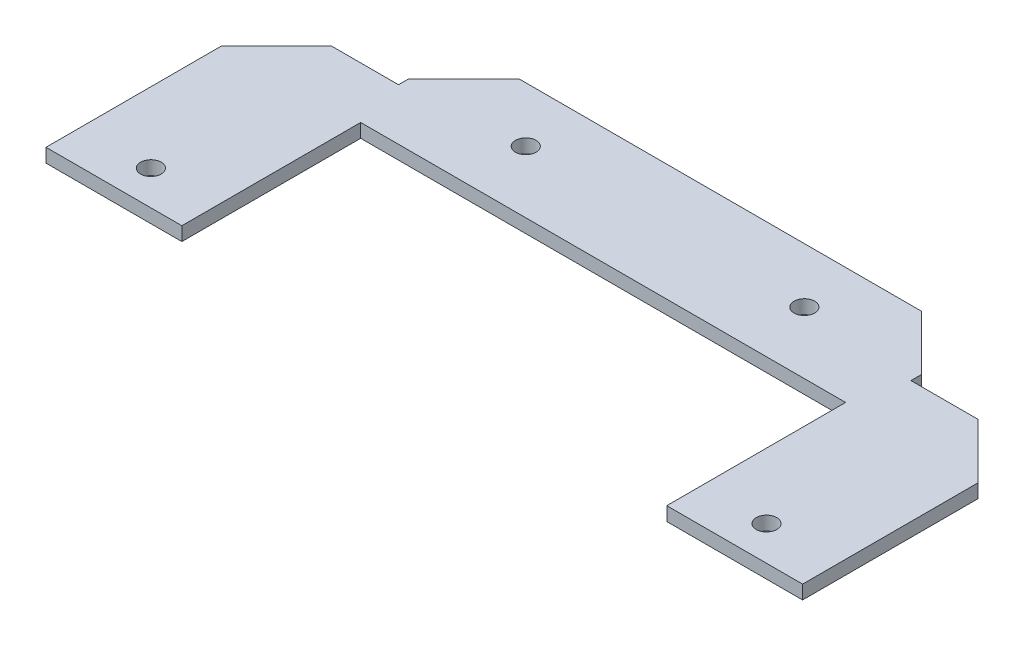
ISO-10303-21;
HEADER;
FILE_DESCRIPTION(('STEP AP214'),'2;1');
FILE_NAME('part.step','',(''),(''),'','','');
FILE_SCHEMA(('AUTOMOTIVE_DESIGN { 1 0 10303 214 1 1 1 1 }'));
ENDSEC;
DATA;
#1=APPLICATION_CONTEXT('core data for automotive mechanical design processes');
#2=APPLICATION_PROTOCOL_DEFINITION('international standard','automotive_design',2000,#1);
#3=PRODUCT_CONTEXT('',#1,'mechanical');
#4=PRODUCT('Part','Part','',(#3));
#5=PRODUCT_RELATED_PRODUCT_CATEGORY('part','',(#4));
#6=PRODUCT_DEFINITION_FORMATION('','',#4);
#7=PRODUCT_DEFINITION_CONTEXT('part definition',#1,'design');
#8=PRODUCT_DEFINITION('design','',#6,#7);
#9=PRODUCT_DEFINITION_SHAPE('','',#8);
#10=(LENGTH_UNIT() NAMED_UNIT(*) SI_UNIT(.MILLI.,.METRE.));
#11=(NAMED_UNIT(*) PLANE_ANGLE_UNIT() SI_UNIT($,.RADIAN.));
#12=(NAMED_UNIT(*) SI_UNIT($,.STERADIAN.) SOLID_ANGLE_UNIT());
#13=UNCERTAINTY_MEASURE_WITH_UNIT(LENGTH_MEASURE(1.E-05),#10,'distance_accuracy_value','');
#14=(GEOMETRIC_REPRESENTATION_CONTEXT(3) GLOBAL_UNCERTAINTY_ASSIGNED_CONTEXT((#13)) GLOBAL_UNIT_ASSIGNED_CONTEXT((#10,
#11,#12)) REPRESENTATION_CONTEXT('',''));
#15=CARTESIAN_POINT('',(0.,0.,0.));
#16=DIRECTION('',(0.,0.,1.));
#17=DIRECTION('',(1.,0.,0.));
#18=AXIS2_PLACEMENT_3D('',#15,#16,#17);
#19=CARTESIAN_POINT('',(0.,2.,0.));
#20=DIRECTION('',(0.,1.,0.));
#21=DIRECTION('',(0.,0.,1.));
#22=AXIS2_PLACEMENT_3D('',#19,#20,#21);
#23=PLANE('',#22);
#24=CARTESIAN_POINT('',(75.25,2.,-35.));
#25=DIRECTION('',(0.,1.,0.));
#26=DIRECTION('',(0.,0.,-1.));
#27=AXIS2_PLACEMENT_3D('',#24,#25,#26);
#28=CIRCLE('',#27,1.50000000000001);
#29=CARTESIAN_POINT('',(75.25,2.,-36.5));
#30=VERTEX_POINT('',#29);
#31=EDGE_CURVE('E346',#30,#30,#28,.T.);
#32=ORIENTED_EDGE('',*,*,#31,.F.);
#33=EDGE_LOOP('',(#32));
#34=FACE_BOUND('',#33,.T.);
#35=CARTESIAN_POINT('',(10.25,2.,-5.));
#36=DIRECTION('',(0.,1.,0.));
#37=DIRECTION('',(0.,0.,1.));
#38=AXIS2_PLACEMENT_3D('',#35,#36,#37);
#39=CIRCLE('',#38,1.5);
#40=CARTESIAN_POINT('',(10.25,2.,-3.5));
#41=VERTEX_POINT('',#40);
#42=EDGE_CURVE('E185',#41,#41,#39,.T.);
#43=ORIENTED_EDGE('',*,*,#42,.F.);
#44=EDGE_LOOP('',(#43));
#45=FACE_BOUND('',#44,.T.);
#46=DIRECTION('',(0.,0.,1.));
#47=VECTOR('',#46,1.);
#48=CARTESIAN_POINT('',(0.,2.,-25.5));
#49=LINE('',#48,#47);
#50=CARTESIAN_POINT('',(0.,2.,-25.5));
#51=VERTEX_POINT('',#50);
#52=CARTESIAN_POINT('',(0.,2.,0.));
#53=VERTEX_POINT('',#52);
#54=EDGE_CURVE('E212',#51,#53,#49,.T.);
#55=ORIENTED_EDGE('',*,*,#54,.T.);
#56=DIRECTION('',(1.,0.,0.));
#57=VECTOR('',#56,1.);
#58=CARTESIAN_POINT('',(0.,2.,0.));
#59=LINE('',#58,#57);
#60=CARTESIAN_POINT('',(19.75,2.,0.));
#61=VERTEX_POINT('',#60);
#62=EDGE_CURVE('E120',#53,#61,#59,.T.);
#63=ORIENTED_EDGE('',*,*,#62,.T.);
#64=DIRECTION('',(0.,0.,-1.));
#65=VECTOR('',#64,1.);
#66=CARTESIAN_POINT('',(19.75,2.,0.));
#67=LINE('',#66,#65);
#68=CARTESIAN_POINT('',(19.75,2.,-26.));
#69=VERTEX_POINT('',#68);
#70=EDGE_CURVE('E251',#61,#69,#67,.T.);
#71=ORIENTED_EDGE('',*,*,#70,.T.);
#72=DIRECTION('',(1.,0.,0.));
#73=VECTOR('',#72,1.);
#74=CARTESIAN_POINT('',(19.75,2.,-26.));
#75=LINE('',#74,#73);
#76=CARTESIAN_POINT('',(90.25,2.,-26.));
#77=VERTEX_POINT('',#76);
#78=EDGE_CURVE('E270',#69,#77,#75,.T.);
#79=ORIENTED_EDGE('',*,*,#78,.T.);
#80=DIRECTION('',(0.,0.,1.));
#81=VECTOR('',#80,1.);
#82=CARTESIAN_POINT('',(90.25,2.,0.));
#83=LINE('',#82,#81);
#84=CARTESIAN_POINT('',(90.25,2.,0.));
#85=VERTEX_POINT('',#84);
#86=EDGE_CURVE('E267',#77,#85,#83,.T.);
#87=ORIENTED_EDGE('',*,*,#86,.T.);
#88=DIRECTION('',(1.,0.,0.));
#89=VECTOR('',#88,1.);
#90=CARTESIAN_POINT('',(110.,2.,0.));
#91=LINE('',#90,#89);
#92=CARTESIAN_POINT('',(110.,2.,0.));
#93=VERTEX_POINT('',#92);
#94=EDGE_CURVE('E269',#85,#93,#91,.T.);
#95=ORIENTED_EDGE('',*,*,#94,.T.);
#96=DIRECTION('',(0.,0.,-1.));
#97=VECTOR('',#96,1.);
#98=CARTESIAN_POINT('',(110.,2.,-25.5));
#99=LINE('',#98,#97);
#100=CARTESIAN_POINT('',(110.,2.,-25.5));
#101=VERTEX_POINT('',#100);
#102=EDGE_CURVE('E272',#93,#101,#99,.T.);
#103=ORIENTED_EDGE('',*,*,#102,.T.);
#104=DIRECTION('',(-0.707106781186547,0.,-0.707106781186548));
#105=VECTOR('',#104,1.);
#106=CARTESIAN_POINT('',(110.,2.,-25.5));
#107=LINE('',#106,#105);
#108=CARTESIAN_POINT('',(102.,2.,-33.5));
#109=VERTEX_POINT('',#108);
#110=EDGE_CURVE('E278',#101,#109,#107,.T.);
#111=ORIENTED_EDGE('',*,*,#110,.T.);
#112=DIRECTION('',(-1.,0.,0.));
#113=VECTOR('',#112,1.);
#114=CARTESIAN_POINT('',(92.25,2.,-33.5));
#115=LINE('',#114,#113);
#116=CARTESIAN_POINT('',(92.25,2.,-33.5));
#117=VERTEX_POINT('',#116);
#118=EDGE_CURVE('E280',#109,#117,#115,.T.);
#119=ORIENTED_EDGE('',*,*,#118,.T.);
#120=DIRECTION('',(0.,0.,-1.));
#121=VECTOR('',#120,1.);
#122=CARTESIAN_POINT('',(92.25,2.,-35.));
#123=LINE('',#122,#121);
#124=CARTESIAN_POINT('',(92.25,2.,-35.));
#125=VERTEX_POINT('',#124);
#126=EDGE_CURVE('E282',#117,#125,#123,.T.);
#127=ORIENTED_EDGE('',*,*,#126,.T.);
#128=DIRECTION('',(-0.707106781186547,0.,-0.707106781186548));
#129=VECTOR('',#128,1.);
#130=CARTESIAN_POINT('',(92.25,2.,-35.));
#131=LINE('',#130,#129);
#132=CARTESIAN_POINT('',(84.25,2.,-43.));
#133=VERTEX_POINT('',#132);
#134=EDGE_CURVE('E284',#125,#133,#131,.T.);
#135=ORIENTED_EDGE('',*,*,#134,.T.);
#136=DIRECTION('',(-1.,0.,0.));
#137=VECTOR('',#136,1.);
#138=CARTESIAN_POINT('',(84.25,2.,-43.));
#139=LINE('',#138,#137);
#140=CARTESIAN_POINT('',(25.75,2.,-43.));
#141=VERTEX_POINT('',#140);
#142=EDGE_CURVE('E286',#133,#141,#139,.T.);
#143=ORIENTED_EDGE('',*,*,#142,.T.);
#144=DIRECTION('',(-0.707106781186547,0.,0.707106781186548));
#145=VECTOR('',#144,1.);
#146=CARTESIAN_POINT('',(17.75,2.,-35.));
#147=LINE('',#146,#145);
#148=CARTESIAN_POINT('',(17.75,2.,-35.));
#149=VERTEX_POINT('',#148);
#150=EDGE_CURVE('E163',#141,#149,#147,.T.);
#151=ORIENTED_EDGE('',*,*,#150,.T.);
#152=DIRECTION('',(0.,0.,1.));
#153=VECTOR('',#152,1.);
#154=CARTESIAN_POINT('',(17.75,2.,-35.));
#155=LINE('',#154,#153);
#156=CARTESIAN_POINT('',(17.75,2.,-33.5));
#157=VERTEX_POINT('',#156);
#158=EDGE_CURVE('E157',#149,#157,#155,.T.);
#159=ORIENTED_EDGE('',*,*,#158,.T.);
#160=DIRECTION('',(-1.,0.,0.));
#161=VECTOR('',#160,1.);
#162=CARTESIAN_POINT('',(17.75,2.,-33.5));
#163=LINE('',#162,#161);
#164=CARTESIAN_POINT('',(7.99999999999997,2.,-33.5));
#165=VERTEX_POINT('',#164);
#166=EDGE_CURVE('E161',#157,#165,#163,.T.);
#167=ORIENTED_EDGE('',*,*,#166,.T.);
#168=DIRECTION('',(-0.707106781186546,0.,0.707106781186549));
#169=VECTOR('',#168,1.);
#170=CARTESIAN_POINT('',(0.,2.,-25.5));
#171=LINE('',#170,#169);
#172=EDGE_CURVE('E53',#165,#51,#171,.T.);
#173=ORIENTED_EDGE('',*,*,#172,.T.);
#174=EDGE_LOOP('',(#55,#63,#71,#79,#87,#95,#103,#111,#119,#127,#135,#143,#151,#159,#167,#173));
#175=FACE_BOUND('',#174,.T.);
#176=CARTESIAN_POINT('',(34.75,2.,-35.));
#177=DIRECTION('',(0.,1.,0.));
#178=DIRECTION('',(0.,0.,1.));
#179=AXIS2_PLACEMENT_3D('',#176,#177,#178);
#180=CIRCLE('',#179,1.5);
#181=CARTESIAN_POINT('',(34.75,2.,-33.5));
#182=VERTEX_POINT('',#181);
#183=EDGE_CURVE('E352',#182,#182,#180,.T.);
#184=ORIENTED_EDGE('',*,*,#183,.F.);
#185=EDGE_LOOP('',(#184));
#186=FACE_BOUND('',#185,.T.);
#187=CARTESIAN_POINT('',(99.75,2.,-5.00000000000001));
#188=DIRECTION('',(0.,1.,0.));
#189=DIRECTION('',(0.,0.,-1.));
#190=AXIS2_PLACEMENT_3D('',#187,#188,#189);
#191=CIRCLE('',#190,1.5);
#192=CARTESIAN_POINT('',(99.75,2.,-6.50000000000001));
#193=VERTEX_POINT('',#192);
#194=EDGE_CURVE('E337',#193,#193,#191,.T.);
#195=ORIENTED_EDGE('',*,*,#194,.F.);
#196=EDGE_LOOP('',(#195));
#197=FACE_BOUND('',#196,.T.);
#198=ADVANCED_FACE('F36',(#34,#45,#175,#186,#197),#23,.T.);
#199=CARTESIAN_POINT('',(0.,0.,0.));
#200=DIRECTION('',(0.,1.,0.));
#201=DIRECTION('',(0.,0.,1.));
#202=AXIS2_PLACEMENT_3D('',#199,#200,#201);
#203=PLANE('',#202);
#204=DIRECTION('',(0.,0.,1.));
#205=VECTOR('',#204,1.);
#206=CARTESIAN_POINT('',(0.,0.,-25.5));
#207=LINE('',#206,#205);
#208=CARTESIAN_POINT('',(0.,0.,-25.5));
#209=VERTEX_POINT('',#208);
#210=CARTESIAN_POINT('',(0.,0.,0.));
#211=VERTEX_POINT('',#210);
#212=EDGE_CURVE('E181',#209,#211,#207,.T.);
#213=ORIENTED_EDGE('',*,*,#212,.F.);
#214=DIRECTION('',(-0.707106781186546,0.,0.707106781186549));
#215=VECTOR('',#214,1.);
#216=CARTESIAN_POINT('',(0.,0.,-25.5));
#217=LINE('',#216,#215);
#218=CARTESIAN_POINT('',(7.99999999999997,0.,-33.5));
#219=VERTEX_POINT('',#218);
#220=EDGE_CURVE('E112',#219,#209,#217,.T.);
#221=ORIENTED_EDGE('',*,*,#220,.F.);
#222=DIRECTION('',(-1.,0.,0.));
#223=VECTOR('',#222,1.);
#224=CARTESIAN_POINT('',(17.75,0.,-33.5));
#225=LINE('',#224,#223);
#226=CARTESIAN_POINT('',(17.75,0.,-33.5));
#227=VERTEX_POINT('',#226);
#228=EDGE_CURVE('E106',#227,#219,#225,.T.);
#229=ORIENTED_EDGE('',*,*,#228,.F.);
#230=DIRECTION('',(0.,0.,1.));
#231=VECTOR('',#230,1.);
#232=CARTESIAN_POINT('',(17.75,0.,-35.));
#233=LINE('',#232,#231);
#234=CARTESIAN_POINT('',(17.75,0.,-35.));
#235=VERTEX_POINT('',#234);
#236=EDGE_CURVE('E171',#235,#227,#233,.T.);
#237=ORIENTED_EDGE('',*,*,#236,.F.);
#238=DIRECTION('',(-0.707106781186547,0.,0.707106781186548));
#239=VECTOR('',#238,1.);
#240=CARTESIAN_POINT('',(17.75,0.,-35.));
#241=LINE('',#240,#239);
#242=CARTESIAN_POINT('',(25.75,0.,-43.));
#243=VERTEX_POINT('',#242);
#244=EDGE_CURVE('E207',#243,#235,#241,.T.);
#245=ORIENTED_EDGE('',*,*,#244,.F.);
#246=DIRECTION('',(-1.,0.,0.));
#247=VECTOR('',#246,1.);
#248=CARTESIAN_POINT('',(84.25,0.,-43.));
#249=LINE('',#248,#247);
#250=CARTESIAN_POINT('',(84.25,0.,-43.));
#251=VERTEX_POINT('',#250);
#252=EDGE_CURVE('E205',#251,#243,#249,.T.);
#253=ORIENTED_EDGE('',*,*,#252,.F.);
#254=DIRECTION('',(-0.707106781186547,0.,-0.707106781186548));
#255=VECTOR('',#254,1.);
#256=CARTESIAN_POINT('',(92.25,0.,-35.));
#257=LINE('',#256,#255);
#258=CARTESIAN_POINT('',(92.25,0.,-35.));
#259=VERTEX_POINT('',#258);
#260=EDGE_CURVE('E203',#259,#251,#257,.T.);
#261=ORIENTED_EDGE('',*,*,#260,.F.);
#262=DIRECTION('',(0.,0.,-1.));
#263=VECTOR('',#262,1.);
#264=CARTESIAN_POINT('',(92.25,0.,-35.));
#265=LINE('',#264,#263);
#266=CARTESIAN_POINT('',(92.25,0.,-33.5));
#267=VERTEX_POINT('',#266);
#268=EDGE_CURVE('E201',#267,#259,#265,.T.);
#269=ORIENTED_EDGE('',*,*,#268,.F.);
#270=DIRECTION('',(-1.,0.,0.));
#271=VECTOR('',#270,1.);
#272=CARTESIAN_POINT('',(92.25,0.,-33.5));
#273=LINE('',#272,#271);
#274=CARTESIAN_POINT('',(102.,0.,-33.5));
#275=VERTEX_POINT('',#274);
#276=EDGE_CURVE('E199',#275,#267,#273,.T.);
#277=ORIENTED_EDGE('',*,*,#276,.F.);
#278=DIRECTION('',(-0.707106781186547,0.,-0.707106781186548));
#279=VECTOR('',#278,1.);
#280=CARTESIAN_POINT('',(110.,0.,-25.5));
#281=LINE('',#280,#279);
#282=CARTESIAN_POINT('',(110.,0.,-25.5));
#283=VERTEX_POINT('',#282);
#284=EDGE_CURVE('E197',#283,#275,#281,.T.);
#285=ORIENTED_EDGE('',*,*,#284,.F.);
#286=DIRECTION('',(0.,0.,-1.));
#287=VECTOR('',#286,1.);
#288=CARTESIAN_POINT('',(110.,0.,-25.5));
#289=LINE('',#288,#287);
#290=CARTESIAN_POINT('',(110.,0.,0.));
#291=VERTEX_POINT('',#290);
#292=EDGE_CURVE('E195',#291,#283,#289,.T.);
#293=ORIENTED_EDGE('',*,*,#292,.F.);
#294=DIRECTION('',(1.,0.,0.));
#295=VECTOR('',#294,1.);
#296=CARTESIAN_POINT('',(110.,0.,0.));
#297=LINE('',#296,#295);
#298=CARTESIAN_POINT('',(90.25,0.,0.));
#299=VERTEX_POINT('',#298);
#300=EDGE_CURVE('E193',#299,#291,#297,.T.);
#301=ORIENTED_EDGE('',*,*,#300,.F.);
#302=DIRECTION('',(0.,0.,1.));
#303=VECTOR('',#302,1.);
#304=CARTESIAN_POINT('',(90.25,0.,0.));
#305=LINE('',#304,#303);
#306=CARTESIAN_POINT('',(90.25,0.,-26.));
#307=VERTEX_POINT('',#306);
#308=EDGE_CURVE('E191',#307,#299,#305,.T.);
#309=ORIENTED_EDGE('',*,*,#308,.F.);
#310=DIRECTION('',(1.,0.,0.));
#311=VECTOR('',#310,1.);
#312=CARTESIAN_POINT('',(19.75,0.,-26.));
#313=LINE('',#312,#311);
#314=CARTESIAN_POINT('',(19.75,0.,-26.));
#315=VERTEX_POINT('',#314);
#316=EDGE_CURVE('E189',#315,#307,#313,.T.);
#317=ORIENTED_EDGE('',*,*,#316,.F.);
#318=DIRECTION('',(0.,0.,-1.));
#319=VECTOR('',#318,1.);
#320=CARTESIAN_POINT('',(19.75,0.,0.));
#321=LINE('',#320,#319);
#322=CARTESIAN_POINT('',(19.75,0.,0.));
#323=VERTEX_POINT('',#322);
#324=EDGE_CURVE('E187',#323,#315,#321,.T.);
#325=ORIENTED_EDGE('',*,*,#324,.F.);
#326=DIRECTION('',(1.,0.,0.));
#327=VECTOR('',#326,1.);
#328=CARTESIAN_POINT('',(0.,0.,0.));
#329=LINE('',#328,#327);
#330=EDGE_CURVE('E184',#211,#323,#329,.T.);
#331=ORIENTED_EDGE('',*,*,#330,.F.);
#332=EDGE_LOOP('',(#213,#221,#229,#237,#245,#253,#261,#269,#277,#285,#293,#301,#309,#317,#325,#331));
#333=FACE_BOUND('',#332,.T.);
#334=CARTESIAN_POINT('',(10.25,0.,-5.));
#335=DIRECTION('',(0.,1.,0.));
#336=DIRECTION('',(0.,0.,1.));
#337=AXIS2_PLACEMENT_3D('',#334,#335,#336);
#338=CIRCLE('',#337,1.5);
#339=CARTESIAN_POINT('',(10.25,0.,-3.5));
#340=VERTEX_POINT('',#339);
#341=EDGE_CURVE('E355',#340,#340,#338,.T.);
#342=ORIENTED_EDGE('',*,*,#341,.T.);
#343=EDGE_LOOP('',(#342));
#344=FACE_BOUND('',#343,.T.);
#345=CARTESIAN_POINT('',(34.75,0.,-35.));
#346=DIRECTION('',(0.,1.,0.));
#347=DIRECTION('',(0.,0.,1.));
#348=AXIS2_PLACEMENT_3D('',#345,#346,#347);
#349=CIRCLE('',#348,1.5);
#350=CARTESIAN_POINT('',(34.75,0.,-33.5));
#351=VERTEX_POINT('',#350);
#352=EDGE_CURVE('E349',#351,#351,#349,.T.);
#353=ORIENTED_EDGE('',*,*,#352,.T.);
#354=EDGE_LOOP('',(#353));
#355=FACE_BOUND('',#354,.T.);
#356=CARTESIAN_POINT('',(75.25,0.,-35.));
#357=DIRECTION('',(0.,1.,0.));
#358=DIRECTION('',(0.,0.,-1.));
#359=AXIS2_PLACEMENT_3D('',#356,#357,#358);
#360=CIRCLE('',#359,1.50000000000001);
#361=CARTESIAN_POINT('',(75.25,0.,-36.5));
#362=VERTEX_POINT('',#361);
#363=EDGE_CURVE('E343',#362,#362,#360,.T.);
#364=ORIENTED_EDGE('',*,*,#363,.T.);
#365=EDGE_LOOP('',(#364));
#366=FACE_BOUND('',#365,.T.);
#367=CARTESIAN_POINT('',(99.75,0.,-5.00000000000001));
#368=DIRECTION('',(0.,1.,0.));
#369=DIRECTION('',(0.,0.,-1.));
#370=AXIS2_PLACEMENT_3D('',#367,#368,#369);
#371=CIRCLE('',#370,1.5);
#372=CARTESIAN_POINT('',(99.75,0.,-6.50000000000001));
#373=VERTEX_POINT('',#372);
#374=EDGE_CURVE('E340',#373,#373,#371,.T.);
#375=ORIENTED_EDGE('',*,*,#374,.T.);
#376=EDGE_LOOP('',(#375));
#377=FACE_BOUND('',#376,.T.);
#378=ADVANCED_FACE('F255',(#333,#344,#355,#366,#377),#203,.F.);
#379=CARTESIAN_POINT('',(0.,2.,-25.5));
#380=DIRECTION('',(1.,0.,0.));
#381=DIRECTION('',(0.,0.,-1.));
#382=AXIS2_PLACEMENT_3D('',#379,#380,#381);
#383=PLANE('',#382);
#384=ORIENTED_EDGE('',*,*,#212,.T.);
#385=DIRECTION('',(0.,-1.,0.));
#386=VECTOR('',#385,1.);
#387=CARTESIAN_POINT('',(0.,2.,0.));
#388=LINE('',#387,#386);
#389=EDGE_CURVE('E11',#53,#211,#388,.T.);
#390=ORIENTED_EDGE('',*,*,#389,.F.);
#391=ORIENTED_EDGE('',*,*,#54,.F.);
#392=DIRECTION('',(0.,-1.,0.));
#393=VECTOR('',#392,1.);
#394=CARTESIAN_POINT('',(0.,2.,-25.5));
#395=LINE('',#394,#393);
#396=EDGE_CURVE('E177',#51,#209,#395,.T.);
#397=ORIENTED_EDGE('',*,*,#396,.T.);
#398=EDGE_LOOP('',(#384,#390,#391,#397));
#399=FACE_BOUND('',#398,.T.);
#400=ADVANCED_FACE('F38',(#399),#383,.F.);
#401=CARTESIAN_POINT('',(0.,2.,0.));
#402=DIRECTION('',(0.,0.,-1.));
#403=DIRECTION('',(-1.,0.,0.));
#404=AXIS2_PLACEMENT_3D('',#401,#402,#403);
#405=PLANE('',#404);
#406=ORIENTED_EDGE('',*,*,#330,.T.);
#407=DIRECTION('',(0.,-1.,0.));
#408=VECTOR('',#407,1.);
#409=CARTESIAN_POINT('',(19.75,2.,0.));
#410=LINE('',#409,#408);
#411=EDGE_CURVE('E45',#61,#323,#410,.T.);
#412=ORIENTED_EDGE('',*,*,#411,.F.);
#413=ORIENTED_EDGE('',*,*,#62,.F.);
#414=ORIENTED_EDGE('',*,*,#389,.T.);
#415=EDGE_LOOP('',(#406,#412,#413,#414));
#416=FACE_BOUND('',#415,.T.);
#417=ADVANCED_FACE('F505',(#416),#405,.F.);
#418=CARTESIAN_POINT('',(19.75,2.,0.));
#419=DIRECTION('',(-1.,0.,0.));
#420=DIRECTION('',(0.,0.,1.));
#421=AXIS2_PLACEMENT_3D('',#418,#419,#420);
#422=PLANE('',#421);
#423=ORIENTED_EDGE('',*,*,#324,.T.);
#424=DIRECTION('',(0.,-1.,0.));
#425=VECTOR('',#424,1.);
#426=CARTESIAN_POINT('',(19.75,2.,-26.));
#427=LINE('',#426,#425);
#428=EDGE_CURVE('E243',#69,#315,#427,.T.);
#429=ORIENTED_EDGE('',*,*,#428,.F.);
#430=ORIENTED_EDGE('',*,*,#70,.F.);
#431=ORIENTED_EDGE('',*,*,#411,.T.);
#432=EDGE_LOOP('',(#423,#429,#430,#431));
#433=FACE_BOUND('',#432,.T.);
#434=ADVANCED_FACE('F249',(#433),#422,.F.);
#435=CARTESIAN_POINT('',(19.75,2.,-26.));
#436=DIRECTION('',(0.,0.,-1.));
#437=DIRECTION('',(-1.,0.,0.));
#438=AXIS2_PLACEMENT_3D('',#435,#436,#437);
#439=PLANE('',#438);
#440=ORIENTED_EDGE('',*,*,#316,.T.);
#441=DIRECTION('',(0.,-1.,0.));
#442=VECTOR('',#441,1.);
#443=CARTESIAN_POINT('',(90.25,2.,-26.));
#444=LINE('',#443,#442);
#445=EDGE_CURVE('E240',#77,#307,#444,.T.);
#446=ORIENTED_EDGE('',*,*,#445,.F.);
#447=ORIENTED_EDGE('',*,*,#78,.F.);
#448=ORIENTED_EDGE('',*,*,#428,.T.);
#449=EDGE_LOOP('',(#440,#446,#447,#448));
#450=FACE_BOUND('',#449,.T.);
#451=ADVANCED_FACE('F261',(#450),#439,.F.);
#452=CARTESIAN_POINT('',(90.25,2.,0.));
#453=DIRECTION('',(1.,0.,0.));
#454=DIRECTION('',(0.,0.,-1.));
#455=AXIS2_PLACEMENT_3D('',#452,#453,#454);
#456=PLANE('',#455);
#457=ORIENTED_EDGE('',*,*,#308,.T.);
#458=DIRECTION('',(0.,-1.,0.));
#459=VECTOR('',#458,1.);
#460=CARTESIAN_POINT('',(90.25,2.,0.));
#461=LINE('',#460,#459);
#462=EDGE_CURVE('E237',#85,#299,#461,.T.);
#463=ORIENTED_EDGE('',*,*,#462,.F.);
#464=ORIENTED_EDGE('',*,*,#86,.F.);
#465=ORIENTED_EDGE('',*,*,#445,.T.);
#466=EDGE_LOOP('',(#457,#463,#464,#465));
#467=FACE_BOUND('',#466,.T.);
#468=ADVANCED_FACE('F265',(#467),#456,.F.);
#469=CARTESIAN_POINT('',(110.,2.,0.));
#470=DIRECTION('',(0.,0.,-1.));
#471=DIRECTION('',(-1.,0.,0.));
#472=AXIS2_PLACEMENT_3D('',#469,#470,#471);
#473=PLANE('',#472);
#474=ORIENTED_EDGE('',*,*,#300,.T.);
#475=DIRECTION('',(0.,-1.,0.));
#476=VECTOR('',#475,1.);
#477=CARTESIAN_POINT('',(110.,2.,0.));
#478=LINE('',#477,#476);
#479=EDGE_CURVE('E234',#93,#291,#478,.T.);
#480=ORIENTED_EDGE('',*,*,#479,.F.);
#481=ORIENTED_EDGE('',*,*,#94,.F.);
#482=ORIENTED_EDGE('',*,*,#462,.T.);
#483=EDGE_LOOP('',(#474,#480,#481,#482));
#484=FACE_BOUND('',#483,.T.);
#485=ADVANCED_FACE('F470',(#484),#473,.F.);
#486=CARTESIAN_POINT('',(110.,2.,-25.5));
#487=DIRECTION('',(-1.,0.,0.));
#488=DIRECTION('',(0.,0.,1.));
#489=AXIS2_PLACEMENT_3D('',#486,#487,#488);
#490=PLANE('',#489);
#491=ORIENTED_EDGE('',*,*,#292,.T.);
#492=DIRECTION('',(0.,-1.,0.));
#493=VECTOR('',#492,1.);
#494=CARTESIAN_POINT('',(110.,2.,-25.5));
#495=LINE('',#494,#493);
#496=EDGE_CURVE('E231',#101,#283,#495,.T.);
#497=ORIENTED_EDGE('',*,*,#496,.F.);
#498=ORIENTED_EDGE('',*,*,#102,.F.);
#499=ORIENTED_EDGE('',*,*,#479,.T.);
#500=EDGE_LOOP('',(#491,#497,#498,#499));
#501=FACE_BOUND('',#500,.T.);
#502=ADVANCED_FACE('F460',(#501),#490,.F.);
#503=CARTESIAN_POINT('',(110.,2.,-25.5));
#504=DIRECTION('',(-0.707106781186548,0.,0.707106781186547));
#505=DIRECTION('',(0.707106781186547,0.,0.707106781186548));
#506=AXIS2_PLACEMENT_3D('',#503,#504,#505);
#507=PLANE('',#506);
#508=ORIENTED_EDGE('',*,*,#284,.T.);
#509=DIRECTION('',(0.,-1.,0.));
#510=VECTOR('',#509,1.);
#511=CARTESIAN_POINT('',(102.,2.,-33.5));
#512=LINE('',#511,#510);
#513=EDGE_CURVE('E228',#109,#275,#512,.T.);
#514=ORIENTED_EDGE('',*,*,#513,.F.);
#515=ORIENTED_EDGE('',*,*,#110,.F.);
#516=ORIENTED_EDGE('',*,*,#496,.T.);
#517=EDGE_LOOP('',(#508,#514,#515,#516));
#518=FACE_BOUND('',#517,.T.);
#519=ADVANCED_FACE('F450',(#518),#507,.F.);
#520=CARTESIAN_POINT('',(92.25,2.,-33.5));
#521=DIRECTION('',(0.,0.,1.));
#522=DIRECTION('',(1.,0.,0.));
#523=AXIS2_PLACEMENT_3D('',#520,#521,#522);
#524=PLANE('',#523);
#525=ORIENTED_EDGE('',*,*,#276,.T.);
#526=DIRECTION('',(0.,-1.,0.));
#527=VECTOR('',#526,1.);
#528=CARTESIAN_POINT('',(92.25,2.,-33.5));
#529=LINE('',#528,#527);
#530=EDGE_CURVE('E225',#117,#267,#529,.T.);
#531=ORIENTED_EDGE('',*,*,#530,.F.);
#532=ORIENTED_EDGE('',*,*,#118,.F.);
#533=ORIENTED_EDGE('',*,*,#513,.T.);
#534=EDGE_LOOP('',(#525,#531,#532,#533));
#535=FACE_BOUND('',#534,.T.);
#536=ADVANCED_FACE('F440',(#535),#524,.F.);
#537=CARTESIAN_POINT('',(92.25,2.,-35.));
#538=DIRECTION('',(-1.,0.,0.));
#539=DIRECTION('',(0.,0.,1.));
#540=AXIS2_PLACEMENT_3D('',#537,#538,#539);
#541=PLANE('',#540);
#542=ORIENTED_EDGE('',*,*,#268,.T.);
#543=DIRECTION('',(0.,-1.,0.));
#544=VECTOR('',#543,1.);
#545=CARTESIAN_POINT('',(92.25,2.,-35.));
#546=LINE('',#545,#544);
#547=EDGE_CURVE('E222',#125,#259,#546,.T.);
#548=ORIENTED_EDGE('',*,*,#547,.F.);
#549=ORIENTED_EDGE('',*,*,#126,.F.);
#550=ORIENTED_EDGE('',*,*,#530,.T.);
#551=EDGE_LOOP('',(#542,#548,#549,#550));
#552=FACE_BOUND('',#551,.T.);
#553=ADVANCED_FACE('F430',(#552),#541,.F.);
#554=CARTESIAN_POINT('',(92.25,2.,-35.));
#555=DIRECTION('',(-0.707106781186548,0.,0.707106781186547));
#556=DIRECTION('',(0.707106781186547,0.,0.707106781186548));
#557=AXIS2_PLACEMENT_3D('',#554,#555,#556);
#558=PLANE('',#557);
#559=ORIENTED_EDGE('',*,*,#260,.T.);
#560=DIRECTION('',(0.,-1.,0.));
#561=VECTOR('',#560,1.);
#562=CARTESIAN_POINT('',(84.25,2.,-43.));
#563=LINE('',#562,#561);
#564=EDGE_CURVE('E219',#133,#251,#563,.T.);
#565=ORIENTED_EDGE('',*,*,#564,.F.);
#566=ORIENTED_EDGE('',*,*,#134,.F.);
#567=ORIENTED_EDGE('',*,*,#547,.T.);
#568=EDGE_LOOP('',(#559,#565,#566,#567));
#569=FACE_BOUND('',#568,.T.);
#570=ADVANCED_FACE('F421',(#569),#558,.F.);
#571=CARTESIAN_POINT('',(84.25,2.,-43.));
#572=DIRECTION('',(0.,0.,1.));
#573=DIRECTION('',(1.,0.,0.));
#574=AXIS2_PLACEMENT_3D('',#571,#572,#573);
#575=PLANE('',#574);
#576=ORIENTED_EDGE('',*,*,#252,.T.);
#577=DIRECTION('',(0.,-1.,0.));
#578=VECTOR('',#577,1.);
#579=CARTESIAN_POINT('',(25.75,2.,-43.));
#580=LINE('',#579,#578);
#581=EDGE_CURVE('E216',#141,#243,#580,.T.);
#582=ORIENTED_EDGE('',*,*,#581,.F.);
#583=ORIENTED_EDGE('',*,*,#142,.F.);
#584=ORIENTED_EDGE('',*,*,#564,.T.);
#585=EDGE_LOOP('',(#576,#582,#583,#584));
#586=FACE_BOUND('',#585,.T.);
#587=ADVANCED_FACE('F292',(#586),#575,.F.);
#588=CARTESIAN_POINT('',(17.75,2.,-35.));
#589=DIRECTION('',(0.707106781186548,0.,0.707106781186547));
#590=DIRECTION('',(0.707106781186547,0.,-0.707106781186548));
#591=AXIS2_PLACEMENT_3D('',#588,#589,#590);
#592=PLANE('',#591);
#593=ORIENTED_EDGE('',*,*,#244,.T.);
#594=DIRECTION('',(0.,-1.,0.));
#595=VECTOR('',#594,1.);
#596=CARTESIAN_POINT('',(17.75,2.,-35.));
#597=LINE('',#596,#595);
#598=EDGE_CURVE('E172',#149,#235,#597,.T.);
#599=ORIENTED_EDGE('',*,*,#598,.F.);
#600=ORIENTED_EDGE('',*,*,#150,.F.);
#601=ORIENTED_EDGE('',*,*,#581,.T.);
#602=EDGE_LOOP('',(#593,#599,#600,#601));
#603=FACE_BOUND('',#602,.T.);
#604=ADVANCED_FACE('F296',(#603),#592,.F.);
#605=CARTESIAN_POINT('',(17.75,2.,-35.));
#606=DIRECTION('',(1.,0.,0.));
#607=DIRECTION('',(0.,0.,-1.));
#608=AXIS2_PLACEMENT_3D('',#605,#606,#607);
#609=PLANE('',#608);
#610=ORIENTED_EDGE('',*,*,#236,.T.);
#611=DIRECTION('',(0.,-1.,0.));
#612=VECTOR('',#611,1.);
#613=CARTESIAN_POINT('',(17.75,2.,-33.5));
#614=LINE('',#613,#612);
#615=EDGE_CURVE('E168',#157,#227,#614,.T.);
#616=ORIENTED_EDGE('',*,*,#615,.F.);
#617=ORIENTED_EDGE('',*,*,#158,.F.);
#618=ORIENTED_EDGE('',*,*,#598,.T.);
#619=EDGE_LOOP('',(#610,#616,#617,#618));
#620=FACE_BOUND('',#619,.T.);
#621=ADVANCED_FACE('F169',(#620),#609,.F.);
#622=CARTESIAN_POINT('',(17.75,2.,-33.5));
#623=DIRECTION('',(0.,0.,1.));
#624=DIRECTION('',(1.,0.,0.));
#625=AXIS2_PLACEMENT_3D('',#622,#623,#624);
#626=PLANE('',#625);
#627=ORIENTED_EDGE('',*,*,#228,.T.);
#628=DIRECTION('',(0.,-1.,0.));
#629=VECTOR('',#628,1.);
#630=CARTESIAN_POINT('',(7.99999999999997,2.,-33.5));
#631=LINE('',#630,#629);
#632=EDGE_CURVE('E173',#165,#219,#631,.T.);
#633=ORIENTED_EDGE('',*,*,#632,.F.);
#634=ORIENTED_EDGE('',*,*,#166,.F.);
#635=ORIENTED_EDGE('',*,*,#615,.T.);
#636=EDGE_LOOP('',(#627,#633,#634,#635));
#637=FACE_BOUND('',#636,.T.);
#638=ADVANCED_FACE('F175',(#637),#626,.F.);
#639=CARTESIAN_POINT('',(0.,2.,-25.5));
#640=DIRECTION('',(0.707106781186549,0.,0.707106781186546));
#641=DIRECTION('',(0.707106781186546,0.,-0.707106781186549));
#642=AXIS2_PLACEMENT_3D('',#639,#640,#641);
#643=PLANE('',#642);
#644=ORIENTED_EDGE('',*,*,#220,.T.);
#645=ORIENTED_EDGE('',*,*,#396,.F.);
#646=ORIENTED_EDGE('',*,*,#172,.F.);
#647=ORIENTED_EDGE('',*,*,#632,.T.);
#648=EDGE_LOOP('',(#644,#645,#646,#647));
#649=FACE_BOUND('',#648,.T.);
#650=ADVANCED_FACE('F300',(#649),#643,.F.);
#651=CARTESIAN_POINT('',(10.25,2.,-5.));
#652=DIRECTION('',(0.,-1.,0.));
#653=DIRECTION('',(0.,0.,-1.));
#654=AXIS2_PLACEMENT_3D('',#651,#652,#653);
#655=CYLINDRICAL_SURFACE('',#654,1.5);
#656=ORIENTED_EDGE('',*,*,#42,.T.);
#657=EDGE_LOOP('',(#656));
#658=FACE_BOUND('',#657,.T.);
#659=ORIENTED_EDGE('',*,*,#341,.F.);
#660=EDGE_LOOP('',(#659));
#661=FACE_BOUND('',#660,.T.);
#662=ADVANCED_FACE('F302',(#658,#661),#655,.F.);
#663=CARTESIAN_POINT('',(34.75,2.,-35.));
#664=DIRECTION('',(0.,-1.,0.));
#665=DIRECTION('',(0.,0.,-1.));
#666=AXIS2_PLACEMENT_3D('',#663,#664,#665);
#667=CYLINDRICAL_SURFACE('',#666,1.5);
#668=ORIENTED_EDGE('',*,*,#183,.T.);
#669=EDGE_LOOP('',(#668));
#670=FACE_BOUND('',#669,.T.);
#671=ORIENTED_EDGE('',*,*,#352,.F.);
#672=EDGE_LOOP('',(#671));
#673=FACE_BOUND('',#672,.T.);
#674=ADVANCED_FACE('F308',(#670,#673),#667,.F.);
#675=CARTESIAN_POINT('',(75.25,2.,-35.));
#676=DIRECTION('',(0.,-1.,0.));
#677=DIRECTION('',(0.,0.,-1.));
#678=AXIS2_PLACEMENT_3D('',#675,#676,#677);
#679=CYLINDRICAL_SURFACE('',#678,1.50000000000001);
#680=ORIENTED_EDGE('',*,*,#31,.T.);
#681=EDGE_LOOP('',(#680));
#682=FACE_BOUND('',#681,.T.);
#683=ORIENTED_EDGE('',*,*,#363,.F.);
#684=EDGE_LOOP('',(#683));
#685=FACE_BOUND('',#684,.T.);
#686=ADVANCED_FACE('F324',(#682,#685),#679,.F.);
#687=CARTESIAN_POINT('',(99.75,2.,-5.00000000000001));
#688=DIRECTION('',(0.,-1.,0.));
#689=DIRECTION('',(0.,0.,-1.));
#690=AXIS2_PLACEMENT_3D('',#687,#688,#689);
#691=CYLINDRICAL_SURFACE('',#690,1.5);
#692=ORIENTED_EDGE('',*,*,#194,.T.);
#693=EDGE_LOOP('',(#692));
#694=FACE_BOUND('',#693,.T.);
#695=ORIENTED_EDGE('',*,*,#374,.F.);
#696=EDGE_LOOP('',(#695));
#697=FACE_BOUND('',#696,.T.);
#698=ADVANCED_FACE('F328',(#694,#697),#691,.F.);
#699=CLOSED_SHELL('',(#198,#378,#400,#417,#434,#451,#468,#485,#502,#519,#536,#553,#570,#587,
#604,#621,#638,#650,#662,#674,#686,#698));
#700=MANIFOLD_SOLID_BREP('B2',#699);
#701=ADVANCED_BREP_SHAPE_REPRESENTATION('',(#18,#700),#14);
#702=SHAPE_DEFINITION_REPRESENTATION(#9,#701);
ENDSEC;
END-ISO-10303-21;
